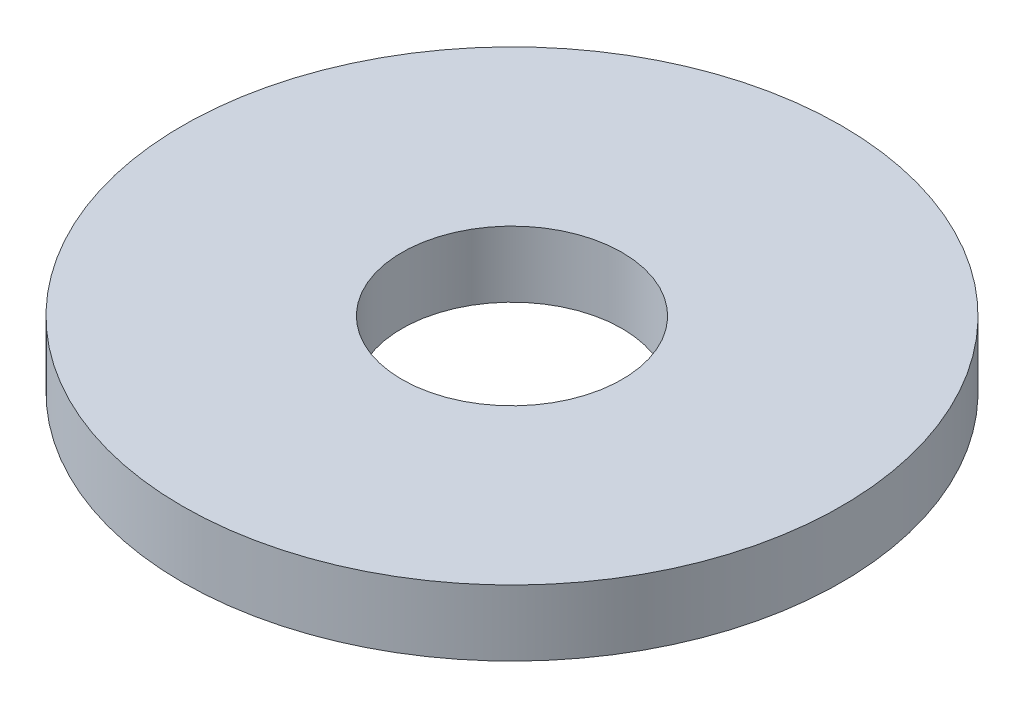
ISO-10303-21;
HEADER;
FILE_DESCRIPTION(('STEP AP214'),'2;1');
FILE_NAME('part.step','',(''),(''),'','','');
FILE_SCHEMA(('AUTOMOTIVE_DESIGN { 1 0 10303 214 1 1 1 1 }'));
ENDSEC;
DATA;
#1=APPLICATION_CONTEXT('core data for automotive mechanical design processes');
#2=APPLICATION_PROTOCOL_DEFINITION('international standard','automotive_design',2000,#1);
#3=PRODUCT_CONTEXT('',#1,'mechanical');
#4=PRODUCT('Part','Part','',(#3));
#5=PRODUCT_RELATED_PRODUCT_CATEGORY('part','',(#4));
#6=PRODUCT_DEFINITION_FORMATION('','',#4);
#7=PRODUCT_DEFINITION_CONTEXT('part definition',#1,'design');
#8=PRODUCT_DEFINITION('design','',#6,#7);
#9=PRODUCT_DEFINITION_SHAPE('','',#8);
#10=(LENGTH_UNIT() NAMED_UNIT(*) SI_UNIT(.MILLI.,.METRE.));
#11=(NAMED_UNIT(*) PLANE_ANGLE_UNIT() SI_UNIT($,.RADIAN.));
#12=(NAMED_UNIT(*) SI_UNIT($,.STERADIAN.) SOLID_ANGLE_UNIT());
#13=UNCERTAINTY_MEASURE_WITH_UNIT(LENGTH_MEASURE(1.E-05),#10,'distance_accuracy_value','');
#14=(GEOMETRIC_REPRESENTATION_CONTEXT(3) GLOBAL_UNCERTAINTY_ASSIGNED_CONTEXT((#13)) GLOBAL_UNIT_ASSIGNED_CONTEXT((#10,
#11,#12)) REPRESENTATION_CONTEXT('',''));
#15=CARTESIAN_POINT('',(0.,0.,0.));
#16=DIRECTION('',(0.,0.,1.));
#17=DIRECTION('',(1.,0.,0.));
#18=AXIS2_PLACEMENT_3D('',#15,#16,#17);
#19=CARTESIAN_POINT('',(0.,5.,0.));
#20=DIRECTION('',(0.,1.,0.));
#21=DIRECTION('',(0.,0.,1.));
#22=AXIS2_PLACEMENT_3D('',#19,#20,#21);
#23=PLANE('',#22);
#24=CARTESIAN_POINT('',(0.,5.,0.));
#25=DIRECTION('',(0.,1.,0.));
#26=DIRECTION('',(0.,0.,1.));
#27=AXIS2_PLACEMENT_3D('',#24,#25,#26);
#28=CIRCLE('',#27,25.);
#29=CARTESIAN_POINT('',(0.,5.,25.));
#30=VERTEX_POINT('',#29);
#31=EDGE_CURVE('E10',#30,#30,#28,.T.);
#32=ORIENTED_EDGE('',*,*,#31,.T.);
#33=EDGE_LOOP('',(#32));
#34=FACE_BOUND('',#33,.T.);
#35=CARTESIAN_POINT('',(0.,5.,0.));
#36=DIRECTION('',(0.,1.,0.));
#37=DIRECTION('',(0.,0.,1.));
#38=AXIS2_PLACEMENT_3D('',#35,#36,#37);
#39=CIRCLE('',#38,8.35);
#40=CARTESIAN_POINT('',(0.,5.,8.35));
#41=VERTEX_POINT('',#40);
#42=EDGE_CURVE('E50',#41,#41,#39,.T.);
#43=ORIENTED_EDGE('',*,*,#42,.F.);
#44=EDGE_LOOP('',(#43));
#45=FACE_BOUND('',#44,.T.);
#46=ADVANCED_FACE('F37',(#34,#45),#23,.T.);
#47=CARTESIAN_POINT('',(0.,0.,0.));
#48=DIRECTION('',(0.,1.,0.));
#49=DIRECTION('',(0.,0.,1.));
#50=AXIS2_PLACEMENT_3D('',#47,#48,#49);
#51=PLANE('',#50);
#52=CARTESIAN_POINT('',(0.,0.,0.));
#53=DIRECTION('',(0.,1.,0.));
#54=DIRECTION('',(0.,0.,1.));
#55=AXIS2_PLACEMENT_3D('',#52,#53,#54);
#56=CIRCLE('',#55,25.);
#57=CARTESIAN_POINT('',(0.,0.,25.));
#58=VERTEX_POINT('',#57);
#59=EDGE_CURVE('E41',#58,#58,#56,.T.);
#60=ORIENTED_EDGE('',*,*,#59,.F.);
#61=EDGE_LOOP('',(#60));
#62=FACE_BOUND('',#61,.T.);
#63=CARTESIAN_POINT('',(0.,0.,0.));
#64=DIRECTION('',(0.,1.,0.));
#65=DIRECTION('',(0.,0.,1.));
#66=AXIS2_PLACEMENT_3D('',#63,#64,#65);
#67=CIRCLE('',#66,8.35);
#68=CARTESIAN_POINT('',(0.,0.,8.35));
#69=VERTEX_POINT('',#68);
#70=EDGE_CURVE('E52',#69,#69,#67,.T.);
#71=ORIENTED_EDGE('',*,*,#70,.T.);
#72=EDGE_LOOP('',(#71));
#73=FACE_BOUND('',#72,.T.);
#74=ADVANCED_FACE('F64',(#62,#73),#51,.F.);
#75=CARTESIAN_POINT('',(0.,5.,0.));
#76=DIRECTION('',(0.,-1.,0.));
#77=DIRECTION('',(0.,0.,-1.));
#78=AXIS2_PLACEMENT_3D('',#75,#76,#77);
#79=CYLINDRICAL_SURFACE('',#78,25.);
#80=ORIENTED_EDGE('',*,*,#31,.F.);
#81=EDGE_LOOP('',(#80));
#82=FACE_BOUND('',#81,.T.);
#83=ORIENTED_EDGE('',*,*,#59,.T.);
#84=EDGE_LOOP('',(#83));
#85=FACE_BOUND('',#84,.T.);
#86=ADVANCED_FACE('F39',(#82,#85),#79,.T.);
#87=CARTESIAN_POINT('',(0.,5.,0.));
#88=DIRECTION('',(0.,-1.,0.));
#89=DIRECTION('',(0.,0.,-1.));
#90=AXIS2_PLACEMENT_3D('',#87,#88,#89);
#91=CYLINDRICAL_SURFACE('',#90,8.35);
#92=ORIENTED_EDGE('',*,*,#42,.T.);
#93=EDGE_LOOP('',(#92));
#94=FACE_BOUND('',#93,.T.);
#95=ORIENTED_EDGE('',*,*,#70,.F.);
#96=EDGE_LOOP('',(#95));
#97=FACE_BOUND('',#96,.T.);
#98=ADVANCED_FACE('F60',(#94,#97),#91,.F.);
#99=CLOSED_SHELL('',(#46,#74,#86,#98));
#100=MANIFOLD_SOLID_BREP('B2',#99);
#101=ADVANCED_BREP_SHAPE_REPRESENTATION('',(#18,#100),#14);
#102=SHAPE_DEFINITION_REPRESENTATION(#9,#101);
ENDSEC;
END-ISO-10303-21;
